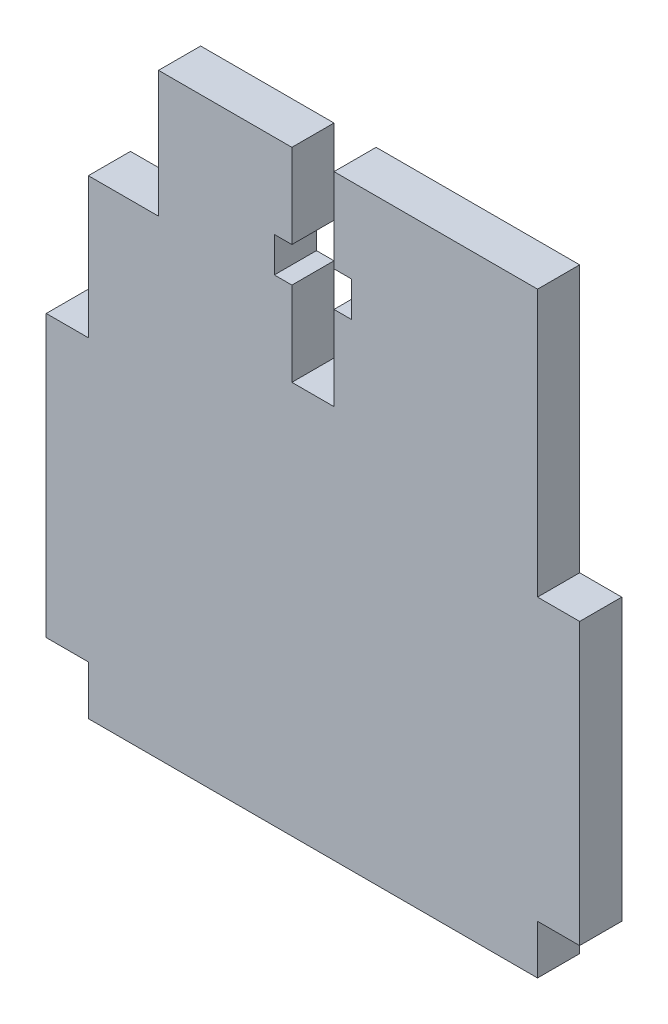
ISO-10303-21;
HEADER;
FILE_DESCRIPTION(('STEP AP214'),'2;1');
FILE_NAME('part.step','',(''),(''),'','','');
FILE_SCHEMA(('AUTOMOTIVE_DESIGN { 1 0 10303 214 1 1 1 1 }'));
ENDSEC;
DATA;
#1=APPLICATION_CONTEXT('core data for automotive mechanical design processes');
#2=APPLICATION_PROTOCOL_DEFINITION('international standard','automotive_design',2000,#1);
#3=PRODUCT_CONTEXT('',#1,'mechanical');
#4=PRODUCT('Part','Part','',(#3));
#5=PRODUCT_RELATED_PRODUCT_CATEGORY('part','',(#4));
#6=PRODUCT_DEFINITION_FORMATION('','',#4);
#7=PRODUCT_DEFINITION_CONTEXT('part definition',#1,'design');
#8=PRODUCT_DEFINITION('design','',#6,#7);
#9=PRODUCT_DEFINITION_SHAPE('','',#8);
#10=(LENGTH_UNIT() NAMED_UNIT(*) SI_UNIT(.MILLI.,.METRE.));
#11=(NAMED_UNIT(*) PLANE_ANGLE_UNIT() SI_UNIT($,.RADIAN.));
#12=(NAMED_UNIT(*) SI_UNIT($,.STERADIAN.) SOLID_ANGLE_UNIT());
#13=UNCERTAINTY_MEASURE_WITH_UNIT(LENGTH_MEASURE(1.E-05),#10,'distance_accuracy_value','');
#14=(GEOMETRIC_REPRESENTATION_CONTEXT(3) GLOBAL_UNCERTAINTY_ASSIGNED_CONTEXT((#13)) GLOBAL_UNIT_ASSIGNED_CONTEXT((#10,
#11,#12)) REPRESENTATION_CONTEXT('',''));
#15=CARTESIAN_POINT('',(0.,0.,0.));
#16=DIRECTION('',(0.,0.,1.));
#17=DIRECTION('',(1.,0.,0.));
#18=AXIS2_PLACEMENT_3D('',#15,#16,#17);
#19=CARTESIAN_POINT('',(0.,42.5,3.));
#20=DIRECTION('',(0.,-1.,0.));
#21=DIRECTION('',(0.,0.,-1.));
#22=AXIS2_PLACEMENT_3D('',#19,#20,#21);
#23=PLANE('',#22);
#24=DIRECTION('',(-1.,0.,0.));
#25=VECTOR('',#24,1.);
#26=CARTESIAN_POINT('',(0.,42.5,0.));
#27=LINE('',#26,#25);
#28=CARTESIAN_POINT('',(32.,42.5,0.));
#29=VERTEX_POINT('',#28);
#30=CARTESIAN_POINT('',(17.5,42.5,0.));
#31=VERTEX_POINT('',#30);
#32=EDGE_CURVE('E244',#29,#31,#27,.T.);
#33=ORIENTED_EDGE('',*,*,#32,.T.);
#34=DIRECTION('',(0.,0.,1.));
#35=VECTOR('',#34,1.);
#36=CARTESIAN_POINT('',(17.5,42.5,0.));
#37=LINE('',#36,#35);
#38=CARTESIAN_POINT('',(17.5,42.5,3.));
#39=VERTEX_POINT('',#38);
#40=EDGE_CURVE('E312',#31,#39,#37,.T.);
#41=ORIENTED_EDGE('',*,*,#40,.T.);
#42=DIRECTION('',(-1.,0.,0.));
#43=VECTOR('',#42,1.);
#44=CARTESIAN_POINT('',(0.,42.5,3.));
#45=LINE('',#44,#43);
#46=CARTESIAN_POINT('',(32.,42.5,3.));
#47=VERTEX_POINT('',#46);
#48=EDGE_CURVE('E237',#47,#39,#45,.T.);
#49=ORIENTED_EDGE('',*,*,#48,.F.);
#50=DIRECTION('',(0.,0.,-1.));
#51=VECTOR('',#50,1.);
#52=CARTESIAN_POINT('',(32.,42.5,3.));
#53=LINE('',#52,#51);
#54=EDGE_CURVE('E248',#47,#29,#53,.T.);
#55=ORIENTED_EDGE('',*,*,#54,.T.);
#56=EDGE_LOOP('',(#33,#41,#49,#55));
#57=FACE_BOUND('',#56,.T.);
#58=ADVANCED_FACE('F35',(#57),#23,.F.);
#59=CARTESIAN_POINT('',(0.,0.,3.));
#60=DIRECTION('',(1.,0.,0.));
#61=DIRECTION('',(0.,0.,-1.));
#62=AXIS2_PLACEMENT_3D('',#59,#60,#61);
#63=PLANE('',#62);
#64=DIRECTION('',(0.,-1.,0.));
#65=VECTOR('',#64,1.);
#66=CARTESIAN_POINT('',(0.,0.,3.));
#67=LINE('',#66,#65);
#68=CARTESIAN_POINT('',(0.,33.5,3.));
#69=VERTEX_POINT('',#68);
#70=CARTESIAN_POINT('',(0.,23.5,3.));
#71=VERTEX_POINT('',#70);
#72=EDGE_CURVE('E224',#69,#71,#67,.T.);
#73=ORIENTED_EDGE('',*,*,#72,.F.);
#74=DIRECTION('',(0.,0.,1.));
#75=VECTOR('',#74,1.);
#76=CARTESIAN_POINT('',(0.,33.5,0.));
#77=LINE('',#76,#75);
#78=CARTESIAN_POINT('',(0.,33.5,0.));
#79=VERTEX_POINT('',#78);
#80=EDGE_CURVE('E211',#79,#69,#77,.T.);
#81=ORIENTED_EDGE('',*,*,#80,.F.);
#82=DIRECTION('',(0.,-1.,0.));
#83=VECTOR('',#82,1.);
#84=CARTESIAN_POINT('',(0.,0.,0.));
#85=LINE('',#84,#83);
#86=CARTESIAN_POINT('',(0.,23.5,0.));
#87=VERTEX_POINT('',#86);
#88=EDGE_CURVE('E222',#79,#87,#85,.T.);
#89=ORIENTED_EDGE('',*,*,#88,.T.);
#90=DIRECTION('',(0.,0.,1.));
#91=VECTOR('',#90,1.);
#92=CARTESIAN_POINT('',(0.,23.5,3.));
#93=LINE('',#92,#91);
#94=EDGE_CURVE('E235',#87,#71,#93,.T.);
#95=ORIENTED_EDGE('',*,*,#94,.T.);
#96=EDGE_LOOP('',(#73,#81,#89,#95));
#97=FACE_BOUND('',#96,.T.);
#98=ADVANCED_FACE('F220',(#97),#63,.F.);
#99=CARTESIAN_POINT('',(32.,0.,3.));
#100=DIRECTION('',(-1.,0.,0.));
#101=DIRECTION('',(0.,0.,1.));
#102=AXIS2_PLACEMENT_3D('',#99,#100,#101);
#103=PLANE('',#102);
#104=DIRECTION('',(0.,1.,0.));
#105=VECTOR('',#104,1.);
#106=CARTESIAN_POINT('',(32.,0.,3.));
#107=LINE('',#106,#105);
#108=CARTESIAN_POINT('',(32.,23.5,3.));
#109=VERTEX_POINT('',#108);
#110=EDGE_CURVE('E293',#109,#47,#107,.T.);
#111=ORIENTED_EDGE('',*,*,#110,.F.);
#112=DIRECTION('',(0.,0.,-1.));
#113=VECTOR('',#112,1.);
#114=CARTESIAN_POINT('',(32.,23.5,3.));
#115=LINE('',#114,#113);
#116=CARTESIAN_POINT('',(32.,23.5,0.));
#117=VERTEX_POINT('',#116);
#118=EDGE_CURVE('E287',#109,#117,#115,.T.);
#119=ORIENTED_EDGE('',*,*,#118,.T.);
#120=DIRECTION('',(0.,1.,0.));
#121=VECTOR('',#120,1.);
#122=CARTESIAN_POINT('',(32.,0.,0.));
#123=LINE('',#122,#121);
#124=EDGE_CURVE('E233',#117,#29,#123,.T.);
#125=ORIENTED_EDGE('',*,*,#124,.T.);
#126=ORIENTED_EDGE('',*,*,#54,.F.);
#127=EDGE_LOOP('',(#111,#119,#125,#126));
#128=FACE_BOUND('',#127,.T.);
#129=ADVANCED_FACE('F307',(#128),#103,.F.);
#130=CARTESIAN_POINT('',(0.,3.5,3.));
#131=VERTEX_POINT('',#130);
#132=CARTESIAN_POINT('',(0.,0.,3.));
#133=VERTEX_POINT('',#132);
#134=EDGE_CURVE('E247',#131,#133,#67,.T.);
#135=ORIENTED_EDGE('',*,*,#134,.F.);
#136=DIRECTION('',(0.,0.,-1.));
#137=VECTOR('',#136,1.);
#138=CARTESIAN_POINT('',(0.,3.5,3.));
#139=LINE('',#138,#137);
#140=CARTESIAN_POINT('',(0.,3.5,0.));
#141=VERTEX_POINT('',#140);
#142=EDGE_CURVE('E283',#131,#141,#139,.T.);
#143=ORIENTED_EDGE('',*,*,#142,.T.);
#144=CARTESIAN_POINT('',(0.,0.,0.));
#145=VERTEX_POINT('',#144);
#146=EDGE_CURVE('E231',#141,#145,#85,.T.);
#147=ORIENTED_EDGE('',*,*,#146,.T.);
#148=DIRECTION('',(0.,0.,-1.));
#149=VECTOR('',#148,1.);
#150=CARTESIAN_POINT('',(0.,0.,3.));
#151=LINE('',#150,#149);
#152=EDGE_CURVE('E11',#133,#145,#151,.T.);
#153=ORIENTED_EDGE('',*,*,#152,.F.);
#154=EDGE_LOOP('',(#135,#143,#147,#153));
#155=FACE_BOUND('',#154,.T.);
#156=ADVANCED_FACE('F37',(#155),#63,.F.);
#157=CARTESIAN_POINT('',(0.,0.,3.));
#158=DIRECTION('',(0.,1.,0.));
#159=DIRECTION('',(0.,0.,1.));
#160=AXIS2_PLACEMENT_3D('',#157,#158,#159);
#161=PLANE('',#160);
#162=DIRECTION('',(1.,0.,0.));
#163=VECTOR('',#162,1.);
#164=CARTESIAN_POINT('',(0.,0.,0.));
#165=LINE('',#164,#163);
#166=CARTESIAN_POINT('',(32.,0.,0.));
#167=VERTEX_POINT('',#166);
#168=EDGE_CURVE('E230',#145,#167,#165,.T.);
#169=ORIENTED_EDGE('',*,*,#168,.T.);
#170=DIRECTION('',(0.,0.,-1.));
#171=VECTOR('',#170,1.);
#172=CARTESIAN_POINT('',(32.,0.,3.));
#173=LINE('',#172,#171);
#174=CARTESIAN_POINT('',(32.,0.,3.));
#175=VERTEX_POINT('',#174);
#176=EDGE_CURVE('E43',#175,#167,#173,.T.);
#177=ORIENTED_EDGE('',*,*,#176,.F.);
#178=DIRECTION('',(1.,0.,0.));
#179=VECTOR('',#178,1.);
#180=CARTESIAN_POINT('',(0.,0.,3.));
#181=LINE('',#180,#179);
#182=EDGE_CURVE('E292',#133,#175,#181,.T.);
#183=ORIENTED_EDGE('',*,*,#182,.F.);
#184=ORIENTED_EDGE('',*,*,#152,.T.);
#185=EDGE_LOOP('',(#169,#177,#183,#184));
#186=FACE_BOUND('',#185,.T.);
#187=ADVANCED_FACE('F396',(#186),#161,.F.);
#188=CARTESIAN_POINT('',(32.,3.5,0.));
#189=VERTEX_POINT('',#188);
#190=EDGE_CURVE('E240',#167,#189,#123,.T.);
#191=ORIENTED_EDGE('',*,*,#190,.T.);
#192=DIRECTION('',(0.,0.,1.));
#193=VECTOR('',#192,1.);
#194=CARTESIAN_POINT('',(32.,3.5,3.));
#195=LINE('',#194,#193);
#196=CARTESIAN_POINT('',(32.,3.5,3.));
#197=VERTEX_POINT('',#196);
#198=EDGE_CURVE('E281',#189,#197,#195,.T.);
#199=ORIENTED_EDGE('',*,*,#198,.T.);
#200=EDGE_CURVE('E258',#175,#197,#107,.T.);
#201=ORIENTED_EDGE('',*,*,#200,.F.);
#202=ORIENTED_EDGE('',*,*,#176,.T.);
#203=EDGE_LOOP('',(#191,#199,#201,#202));
#204=FACE_BOUND('',#203,.T.);
#205=ADVANCED_FACE('F255',(#204),#103,.F.);
#206=CARTESIAN_POINT('',(14.5,42.5,0.));
#207=VERTEX_POINT('',#206);
#208=CARTESIAN_POINT('',(5.,42.5,0.));
#209=VERTEX_POINT('',#208);
#210=EDGE_CURVE('E243',#207,#209,#27,.T.);
#211=ORIENTED_EDGE('',*,*,#210,.T.);
#212=DIRECTION('',(0.,0.,1.));
#213=VECTOR('',#212,1.);
#214=CARTESIAN_POINT('',(5.,42.5,0.));
#215=LINE('',#214,#213);
#216=CARTESIAN_POINT('',(5.,42.5,3.));
#217=VERTEX_POINT('',#216);
#218=EDGE_CURVE('E402',#209,#217,#215,.T.);
#219=ORIENTED_EDGE('',*,*,#218,.T.);
#220=CARTESIAN_POINT('',(14.5,42.5,3.));
#221=VERTEX_POINT('',#220);
#222=EDGE_CURVE('E294',#221,#217,#45,.T.);
#223=ORIENTED_EDGE('',*,*,#222,.F.);
#224=DIRECTION('',(0.,0.,1.));
#225=VECTOR('',#224,1.);
#226=CARTESIAN_POINT('',(14.5,42.5,0.));
#227=LINE('',#226,#225);
#228=EDGE_CURVE('E345',#207,#221,#227,.T.);
#229=ORIENTED_EDGE('',*,*,#228,.F.);
#230=EDGE_LOOP('',(#211,#219,#223,#229));
#231=FACE_BOUND('',#230,.T.);
#232=ADVANCED_FACE('F383',(#231),#23,.F.);
#233=CARTESIAN_POINT('',(0.,0.,3.));
#234=DIRECTION('',(0.,0.,-1.));
#235=DIRECTION('',(-1.,0.,0.));
#236=AXIS2_PLACEMENT_3D('',#233,#234,#235);
#237=PLANE('',#236);
#238=ORIENTED_EDGE('',*,*,#222,.T.);
#239=DIRECTION('',(0.,1.,0.));
#240=VECTOR('',#239,1.);
#241=CARTESIAN_POINT('',(5.,42.5,3.));
#242=LINE('',#241,#240);
#243=CARTESIAN_POINT('',(5.,33.5,3.));
#244=VERTEX_POINT('',#243);
#245=EDGE_CURVE('E216',#244,#217,#242,.T.);
#246=ORIENTED_EDGE('',*,*,#245,.F.);
#247=DIRECTION('',(1.,0.,0.));
#248=VECTOR('',#247,1.);
#249=CARTESIAN_POINT('',(0.,33.5,3.));
#250=LINE('',#249,#248);
#251=EDGE_CURVE('E407',#69,#244,#250,.T.);
#252=ORIENTED_EDGE('',*,*,#251,.F.);
#253=ORIENTED_EDGE('',*,*,#72,.T.);
#254=DIRECTION('',(1.,0.,0.));
#255=VECTOR('',#254,1.);
#256=CARTESIAN_POINT('',(-3.,23.5,3.));
#257=LINE('',#256,#255);
#258=CARTESIAN_POINT('',(-3.,23.5,3.));
#259=VERTEX_POINT('',#258);
#260=EDGE_CURVE('E284',#259,#71,#257,.T.);
#261=ORIENTED_EDGE('',*,*,#260,.F.);
#262=DIRECTION('',(0.,-1.,0.));
#263=VECTOR('',#262,1.);
#264=CARTESIAN_POINT('',(-3.,3.5,3.));
#265=LINE('',#264,#263);
#266=CARTESIAN_POINT('',(-3.,3.5,3.));
#267=VERTEX_POINT('',#266);
#268=EDGE_CURVE('E353',#259,#267,#265,.T.);
#269=ORIENTED_EDGE('',*,*,#268,.T.);
#270=DIRECTION('',(1.,0.,0.));
#271=VECTOR('',#270,1.);
#272=CARTESIAN_POINT('',(-3.,3.5,3.));
#273=LINE('',#272,#271);
#274=EDGE_CURVE('E272',#267,#131,#273,.T.);
#275=ORIENTED_EDGE('',*,*,#274,.T.);
#276=ORIENTED_EDGE('',*,*,#134,.T.);
#277=ORIENTED_EDGE('',*,*,#182,.T.);
#278=ORIENTED_EDGE('',*,*,#200,.T.);
#279=CARTESIAN_POINT('',(35.,3.5,3.));
#280=VERTEX_POINT('',#279);
#281=EDGE_CURVE('E276',#197,#280,#273,.T.);
#282=ORIENTED_EDGE('',*,*,#281,.T.);
#283=DIRECTION('',(0.,-1.,0.));
#284=VECTOR('',#283,1.);
#285=CARTESIAN_POINT('',(35.,3.5,3.));
#286=LINE('',#285,#284);
#287=CARTESIAN_POINT('',(35.,23.5,3.));
#288=VERTEX_POINT('',#287);
#289=EDGE_CURVE('E316',#288,#280,#286,.T.);
#290=ORIENTED_EDGE('',*,*,#289,.F.);
#291=EDGE_CURVE('E305',#109,#288,#257,.T.);
#292=ORIENTED_EDGE('',*,*,#291,.F.);
#293=ORIENTED_EDGE('',*,*,#110,.T.);
#294=ORIENTED_EDGE('',*,*,#48,.T.);
#295=DIRECTION('',(0.,1.,0.));
#296=VECTOR('',#295,1.);
#297=CARTESIAN_POINT('',(17.5,36.5,3.));
#298=LINE('',#297,#296);
#299=CARTESIAN_POINT('',(17.5,36.5,3.));
#300=VERTEX_POINT('',#299);
#301=EDGE_CURVE('E325',#300,#39,#298,.T.);
#302=ORIENTED_EDGE('',*,*,#301,.F.);
#303=DIRECTION('',(-1.,0.,0.));
#304=VECTOR('',#303,1.);
#305=CARTESIAN_POINT('',(18.75,36.5,3.));
#306=LINE('',#305,#304);
#307=CARTESIAN_POINT('',(18.75,36.5,3.));
#308=VERTEX_POINT('',#307);
#309=EDGE_CURVE('E465',#308,#300,#306,.T.);
#310=ORIENTED_EDGE('',*,*,#309,.F.);
#311=DIRECTION('',(0.,1.,0.));
#312=VECTOR('',#311,1.);
#313=CARTESIAN_POINT('',(18.75,34.,3.));
#314=LINE('',#313,#312);
#315=CARTESIAN_POINT('',(18.75,34.,3.));
#316=VERTEX_POINT('',#315);
#317=EDGE_CURVE('E463',#316,#308,#314,.T.);
#318=ORIENTED_EDGE('',*,*,#317,.F.);
#319=DIRECTION('',(1.,0.,0.));
#320=VECTOR('',#319,1.);
#321=CARTESIAN_POINT('',(17.5,34.,3.));
#322=LINE('',#321,#320);
#323=CARTESIAN_POINT('',(17.5,34.,3.));
#324=VERTEX_POINT('',#323);
#325=EDGE_CURVE('E460',#324,#316,#322,.T.);
#326=ORIENTED_EDGE('',*,*,#325,.F.);
#327=DIRECTION('',(0.,1.,0.));
#328=VECTOR('',#327,1.);
#329=CARTESIAN_POINT('',(17.5,28.,3.));
#330=LINE('',#329,#328);
#331=CARTESIAN_POINT('',(17.5,28.,3.));
#332=VERTEX_POINT('',#331);
#333=EDGE_CURVE('E457',#332,#324,#330,.T.);
#334=ORIENTED_EDGE('',*,*,#333,.F.);
#335=DIRECTION('',(1.,0.,0.));
#336=VECTOR('',#335,1.);
#337=CARTESIAN_POINT('',(14.5,28.,3.));
#338=LINE('',#337,#336);
#339=CARTESIAN_POINT('',(14.5,28.,3.));
#340=VERTEX_POINT('',#339);
#341=EDGE_CURVE('E454',#340,#332,#338,.T.);
#342=ORIENTED_EDGE('',*,*,#341,.F.);
#343=DIRECTION('',(0.,-1.,0.));
#344=VECTOR('',#343,1.);
#345=CARTESIAN_POINT('',(14.5,34.,3.));
#346=LINE('',#345,#344);
#347=CARTESIAN_POINT('',(14.5,34.,3.));
#348=VERTEX_POINT('',#347);
#349=EDGE_CURVE('E451',#348,#340,#346,.T.);
#350=ORIENTED_EDGE('',*,*,#349,.F.);
#351=DIRECTION('',(1.,0.,0.));
#352=VECTOR('',#351,1.);
#353=CARTESIAN_POINT('',(13.25,34.,3.));
#354=LINE('',#353,#352);
#355=CARTESIAN_POINT('',(13.25,34.,3.));
#356=VERTEX_POINT('',#355);
#357=EDGE_CURVE('E448',#356,#348,#354,.T.);
#358=ORIENTED_EDGE('',*,*,#357,.F.);
#359=DIRECTION('',(0.,-1.,0.));
#360=VECTOR('',#359,1.);
#361=CARTESIAN_POINT('',(13.25,36.5,3.));
#362=LINE('',#361,#360);
#363=CARTESIAN_POINT('',(13.25,36.5,3.));
#364=VERTEX_POINT('',#363);
#365=EDGE_CURVE('E445',#364,#356,#362,.T.);
#366=ORIENTED_EDGE('',*,*,#365,.F.);
#367=DIRECTION('',(-1.,0.,0.));
#368=VECTOR('',#367,1.);
#369=CARTESIAN_POINT('',(14.5,36.5,3.));
#370=LINE('',#369,#368);
#371=CARTESIAN_POINT('',(14.5,36.5,3.));
#372=VERTEX_POINT('',#371);
#373=EDGE_CURVE('E442',#372,#364,#370,.T.);
#374=ORIENTED_EDGE('',*,*,#373,.F.);
#375=DIRECTION('',(0.,-1.,0.));
#376=VECTOR('',#375,1.);
#377=CARTESIAN_POINT('',(14.5,42.5,3.));
#378=LINE('',#377,#376);
#379=EDGE_CURVE('E411',#221,#372,#378,.T.);
#380=ORIENTED_EDGE('',*,*,#379,.F.);
#381=EDGE_LOOP('',(#238,#246,#252,#253,#261,#269,#275,#276,#277,#278,#282,#290,#292,#293,#294,
#302,#310,#318,#326,#334,#342,#350,#358,#366,#374,#380));
#382=FACE_BOUND('',#381,.T.);
#383=ADVANCED_FACE('F301',(#382),#237,.F.);
#384=CARTESIAN_POINT('',(0.,0.,0.));
#385=DIRECTION('',(0.,0.,-1.));
#386=DIRECTION('',(-1.,0.,0.));
#387=AXIS2_PLACEMENT_3D('',#384,#385,#386);
#388=PLANE('',#387);
#389=DIRECTION('',(0.,1.,0.));
#390=VECTOR('',#389,1.);
#391=CARTESIAN_POINT('',(5.,42.5,0.));
#392=LINE('',#391,#390);
#393=CARTESIAN_POINT('',(5.,33.5,0.));
#394=VERTEX_POINT('',#393);
#395=EDGE_CURVE('E50',#394,#209,#392,.T.);
#396=ORIENTED_EDGE('',*,*,#395,.T.);
#397=ORIENTED_EDGE('',*,*,#210,.F.);
#398=DIRECTION('',(0.,-1.,0.));
#399=VECTOR('',#398,1.);
#400=CARTESIAN_POINT('',(14.5,42.5,0.));
#401=LINE('',#400,#399);
#402=CARTESIAN_POINT('',(14.5,36.5,0.));
#403=VERTEX_POINT('',#402);
#404=EDGE_CURVE('E404',#207,#403,#401,.T.);
#405=ORIENTED_EDGE('',*,*,#404,.T.);
#406=DIRECTION('',(-1.,0.,0.));
#407=VECTOR('',#406,1.);
#408=CARTESIAN_POINT('',(14.5,36.5,0.));
#409=LINE('',#408,#407);
#410=CARTESIAN_POINT('',(13.25,36.5,0.));
#411=VERTEX_POINT('',#410);
#412=EDGE_CURVE('E58',#403,#411,#409,.T.);
#413=ORIENTED_EDGE('',*,*,#412,.T.);
#414=DIRECTION('',(0.,-1.,0.));
#415=VECTOR('',#414,1.);
#416=CARTESIAN_POINT('',(13.25,36.5,0.));
#417=LINE('',#416,#415);
#418=CARTESIAN_POINT('',(13.25,34.,0.));
#419=VERTEX_POINT('',#418);
#420=EDGE_CURVE('E415',#411,#419,#417,.T.);
#421=ORIENTED_EDGE('',*,*,#420,.T.);
#422=DIRECTION('',(1.,0.,0.));
#423=VECTOR('',#422,1.);
#424=CARTESIAN_POINT('',(13.25,34.,0.));
#425=LINE('',#424,#423);
#426=CARTESIAN_POINT('',(14.5,34.,0.));
#427=VERTEX_POINT('',#426);
#428=EDGE_CURVE('E418',#419,#427,#425,.T.);
#429=ORIENTED_EDGE('',*,*,#428,.T.);
#430=DIRECTION('',(0.,-1.,0.));
#431=VECTOR('',#430,1.);
#432=CARTESIAN_POINT('',(14.5,34.,0.));
#433=LINE('',#432,#431);
#434=CARTESIAN_POINT('',(14.5,28.,0.));
#435=VERTEX_POINT('',#434);
#436=EDGE_CURVE('E421',#427,#435,#433,.T.);
#437=ORIENTED_EDGE('',*,*,#436,.T.);
#438=DIRECTION('',(1.,0.,0.));
#439=VECTOR('',#438,1.);
#440=CARTESIAN_POINT('',(14.5,28.,0.));
#441=LINE('',#440,#439);
#442=CARTESIAN_POINT('',(17.5,28.,0.));
#443=VERTEX_POINT('',#442);
#444=EDGE_CURVE('E424',#435,#443,#441,.T.);
#445=ORIENTED_EDGE('',*,*,#444,.T.);
#446=DIRECTION('',(0.,1.,0.));
#447=VECTOR('',#446,1.);
#448=CARTESIAN_POINT('',(17.5,28.,0.));
#449=LINE('',#448,#447);
#450=CARTESIAN_POINT('',(17.5,34.,0.));
#451=VERTEX_POINT('',#450);
#452=EDGE_CURVE('E427',#443,#451,#449,.T.);
#453=ORIENTED_EDGE('',*,*,#452,.T.);
#454=DIRECTION('',(1.,0.,0.));
#455=VECTOR('',#454,1.);
#456=CARTESIAN_POINT('',(17.5,34.,0.));
#457=LINE('',#456,#455);
#458=CARTESIAN_POINT('',(18.75,34.,0.));
#459=VERTEX_POINT('',#458);
#460=EDGE_CURVE('E430',#451,#459,#457,.T.);
#461=ORIENTED_EDGE('',*,*,#460,.T.);
#462=DIRECTION('',(0.,1.,0.));
#463=VECTOR('',#462,1.);
#464=CARTESIAN_POINT('',(18.75,34.,0.));
#465=LINE('',#464,#463);
#466=CARTESIAN_POINT('',(18.75,36.5,0.));
#467=VERTEX_POINT('',#466);
#468=EDGE_CURVE('E433',#459,#467,#465,.T.);
#469=ORIENTED_EDGE('',*,*,#468,.T.);
#470=DIRECTION('',(-1.,0.,0.));
#471=VECTOR('',#470,1.);
#472=CARTESIAN_POINT('',(18.75,36.5,0.));
#473=LINE('',#472,#471);
#474=CARTESIAN_POINT('',(17.5,36.5,0.));
#475=VERTEX_POINT('',#474);
#476=EDGE_CURVE('E436',#467,#475,#473,.T.);
#477=ORIENTED_EDGE('',*,*,#476,.T.);
#478=DIRECTION('',(0.,1.,0.));
#479=VECTOR('',#478,1.);
#480=CARTESIAN_POINT('',(17.5,36.5,0.));
#481=LINE('',#480,#479);
#482=EDGE_CURVE('E346',#475,#31,#481,.T.);
#483=ORIENTED_EDGE('',*,*,#482,.T.);
#484=ORIENTED_EDGE('',*,*,#32,.F.);
#485=ORIENTED_EDGE('',*,*,#124,.F.);
#486=DIRECTION('',(1.,0.,0.));
#487=VECTOR('',#486,1.);
#488=CARTESIAN_POINT('',(-3.,23.5,0.));
#489=LINE('',#488,#487);
#490=CARTESIAN_POINT('',(35.,23.5,0.));
#491=VERTEX_POINT('',#490);
#492=EDGE_CURVE('E274',#117,#491,#489,.T.);
#493=ORIENTED_EDGE('',*,*,#492,.T.);
#494=DIRECTION('',(0.,1.,0.));
#495=VECTOR('',#494,1.);
#496=CARTESIAN_POINT('',(35.,3.5,0.));
#497=LINE('',#496,#495);
#498=CARTESIAN_POINT('',(35.,3.5,0.));
#499=VERTEX_POINT('',#498);
#500=EDGE_CURVE('E267',#499,#491,#497,.T.);
#501=ORIENTED_EDGE('',*,*,#500,.F.);
#502=DIRECTION('',(1.,0.,0.));
#503=VECTOR('',#502,1.);
#504=CARTESIAN_POINT('',(-3.,3.5,0.));
#505=LINE('',#504,#503);
#506=EDGE_CURVE('E265',#189,#499,#505,.T.);
#507=ORIENTED_EDGE('',*,*,#506,.F.);
#508=ORIENTED_EDGE('',*,*,#190,.F.);
#509=ORIENTED_EDGE('',*,*,#168,.F.);
#510=ORIENTED_EDGE('',*,*,#146,.F.);
#511=CARTESIAN_POINT('',(-3.,3.5,0.));
#512=VERTEX_POINT('',#511);
#513=EDGE_CURVE('E271',#512,#141,#505,.T.);
#514=ORIENTED_EDGE('',*,*,#513,.F.);
#515=DIRECTION('',(0.,1.,0.));
#516=VECTOR('',#515,1.);
#517=CARTESIAN_POINT('',(-3.,3.5,0.));
#518=LINE('',#517,#516);
#519=CARTESIAN_POINT('',(-3.,23.5,0.));
#520=VERTEX_POINT('',#519);
#521=EDGE_CURVE('E359',#512,#520,#518,.T.);
#522=ORIENTED_EDGE('',*,*,#521,.T.);
#523=EDGE_CURVE('E229',#520,#87,#489,.T.);
#524=ORIENTED_EDGE('',*,*,#523,.T.);
#525=ORIENTED_EDGE('',*,*,#88,.F.);
#526=DIRECTION('',(1.,0.,0.));
#527=VECTOR('',#526,1.);
#528=CARTESIAN_POINT('',(0.,33.5,0.));
#529=LINE('',#528,#527);
#530=EDGE_CURVE('E207',#79,#394,#529,.T.);
#531=ORIENTED_EDGE('',*,*,#530,.T.);
#532=EDGE_LOOP('',(#396,#397,#405,#413,#421,#429,#437,#445,#453,#461,#469,#477,#483,#484,#485,
#493,#501,#507,#508,#509,#510,#514,#522,#524,#525,#531));
#533=FACE_BOUND('',#532,.T.);
#534=ADVANCED_FACE('F227',(#533),#388,.T.);
#535=CARTESIAN_POINT('',(35.,0.,0.));
#536=DIRECTION('',(-1.,0.,0.));
#537=DIRECTION('',(0.,0.,1.));
#538=AXIS2_PLACEMENT_3D('',#535,#536,#537);
#539=PLANE('',#538);
#540=ORIENTED_EDGE('',*,*,#289,.T.);
#541=DIRECTION('',(0.,0.,-1.));
#542=VECTOR('',#541,1.);
#543=CARTESIAN_POINT('',(35.,3.5,3.));
#544=LINE('',#543,#542);
#545=EDGE_CURVE('E320',#280,#499,#544,.T.);
#546=ORIENTED_EDGE('',*,*,#545,.T.);
#547=ORIENTED_EDGE('',*,*,#500,.T.);
#548=DIRECTION('',(0.,0.,1.));
#549=VECTOR('',#548,1.);
#550=CARTESIAN_POINT('',(35.,23.5,3.));
#551=LINE('',#550,#549);
#552=EDGE_CURVE('E350',#491,#288,#551,.T.);
#553=ORIENTED_EDGE('',*,*,#552,.T.);
#554=EDGE_LOOP('',(#540,#546,#547,#553));
#555=FACE_BOUND('',#554,.T.);
#556=ADVANCED_FACE('F368',(#555),#539,.F.);
#557=CARTESIAN_POINT('',(-3.,3.5,3.));
#558=DIRECTION('',(0.,-1.,0.));
#559=DIRECTION('',(0.,0.,-1.));
#560=AXIS2_PLACEMENT_3D('',#557,#558,#559);
#561=PLANE('',#560);
#562=ORIENTED_EDGE('',*,*,#198,.F.);
#563=ORIENTED_EDGE('',*,*,#506,.T.);
#564=ORIENTED_EDGE('',*,*,#545,.F.);
#565=ORIENTED_EDGE('',*,*,#281,.F.);
#566=EDGE_LOOP('',(#562,#563,#564,#565));
#567=FACE_BOUND('',#566,.T.);
#568=ADVANCED_FACE('F372',(#567),#561,.T.);
#569=CARTESIAN_POINT('',(-3.,23.5,3.));
#570=DIRECTION('',(0.,1.,0.));
#571=DIRECTION('',(0.,0.,1.));
#572=AXIS2_PLACEMENT_3D('',#569,#570,#571);
#573=PLANE('',#572);
#574=ORIENTED_EDGE('',*,*,#118,.F.);
#575=ORIENTED_EDGE('',*,*,#291,.T.);
#576=ORIENTED_EDGE('',*,*,#552,.F.);
#577=ORIENTED_EDGE('',*,*,#492,.F.);
#578=EDGE_LOOP('',(#574,#575,#576,#577));
#579=FACE_BOUND('',#578,.T.);
#580=ADVANCED_FACE('F369',(#579),#573,.T.);
#581=ORIENTED_EDGE('',*,*,#94,.F.);
#582=ORIENTED_EDGE('',*,*,#523,.F.);
#583=DIRECTION('',(0.,0.,1.));
#584=VECTOR('',#583,1.);
#585=CARTESIAN_POINT('',(-3.,23.5,3.));
#586=LINE('',#585,#584);
#587=EDGE_CURVE('E361',#520,#259,#586,.T.);
#588=ORIENTED_EDGE('',*,*,#587,.T.);
#589=ORIENTED_EDGE('',*,*,#260,.T.);
#590=EDGE_LOOP('',(#581,#582,#588,#589));
#591=FACE_BOUND('',#590,.T.);
#592=ADVANCED_FACE('F371',(#591),#573,.T.);
#593=ORIENTED_EDGE('',*,*,#142,.F.);
#594=ORIENTED_EDGE('',*,*,#274,.F.);
#595=DIRECTION('',(0.,0.,-1.));
#596=VECTOR('',#595,1.);
#597=CARTESIAN_POINT('',(-3.,3.5,3.));
#598=LINE('',#597,#596);
#599=EDGE_CURVE('E356',#267,#512,#598,.T.);
#600=ORIENTED_EDGE('',*,*,#599,.T.);
#601=ORIENTED_EDGE('',*,*,#513,.T.);
#602=EDGE_LOOP('',(#593,#594,#600,#601));
#603=FACE_BOUND('',#602,.T.);
#604=ADVANCED_FACE('F378',(#603),#561,.T.);
#605=CARTESIAN_POINT('',(-3.,0.,0.));
#606=DIRECTION('',(-1.,0.,0.));
#607=DIRECTION('',(0.,0.,1.));
#608=AXIS2_PLACEMENT_3D('',#605,#606,#607);
#609=PLANE('',#608);
#610=ORIENTED_EDGE('',*,*,#268,.F.);
#611=ORIENTED_EDGE('',*,*,#587,.F.);
#612=ORIENTED_EDGE('',*,*,#521,.F.);
#613=ORIENTED_EDGE('',*,*,#599,.F.);
#614=EDGE_LOOP('',(#610,#611,#612,#613));
#615=FACE_BOUND('',#614,.T.);
#616=ADVANCED_FACE('F518',(#615),#609,.T.);
#617=CARTESIAN_POINT('',(17.5,36.5,0.));
#618=DIRECTION('',(1.,0.,0.));
#619=DIRECTION('',(0.,1.,0.));
#620=AXIS2_PLACEMENT_3D('',#617,#618,#619);
#621=PLANE('',#620);
#622=ORIENTED_EDGE('',*,*,#301,.T.);
#623=ORIENTED_EDGE('',*,*,#40,.F.);
#624=ORIENTED_EDGE('',*,*,#482,.F.);
#625=DIRECTION('',(0.,0.,1.));
#626=VECTOR('',#625,1.);
#627=CARTESIAN_POINT('',(17.5,36.5,0.));
#628=LINE('',#627,#626);
#629=EDGE_CURVE('E317',#475,#300,#628,.T.);
#630=ORIENTED_EDGE('',*,*,#629,.T.);
#631=EDGE_LOOP('',(#622,#623,#624,#630));
#632=FACE_BOUND('',#631,.T.);
#633=ADVANCED_FACE('F469',(#632),#621,.F.);
#634=CARTESIAN_POINT('',(18.75,36.5,0.));
#635=DIRECTION('',(0.,1.,0.));
#636=DIRECTION('',(0.,0.,1.));
#637=AXIS2_PLACEMENT_3D('',#634,#635,#636);
#638=PLANE('',#637);
#639=ORIENTED_EDGE('',*,*,#309,.T.);
#640=ORIENTED_EDGE('',*,*,#629,.F.);
#641=ORIENTED_EDGE('',*,*,#476,.F.);
#642=DIRECTION('',(0.,0.,1.));
#643=VECTOR('',#642,1.);
#644=CARTESIAN_POINT('',(18.75,36.5,0.));
#645=LINE('',#644,#643);
#646=EDGE_CURVE('E322',#467,#308,#645,.T.);
#647=ORIENTED_EDGE('',*,*,#646,.T.);
#648=EDGE_LOOP('',(#639,#640,#641,#647));
#649=FACE_BOUND('',#648,.T.);
#650=ADVANCED_FACE('F517',(#649),#638,.F.);
#651=CARTESIAN_POINT('',(18.75,34.,0.));
#652=DIRECTION('',(1.,0.,0.));
#653=DIRECTION('',(0.,1.,0.));
#654=AXIS2_PLACEMENT_3D('',#651,#652,#653);
#655=PLANE('',#654);
#656=ORIENTED_EDGE('',*,*,#317,.T.);
#657=ORIENTED_EDGE('',*,*,#646,.F.);
#658=ORIENTED_EDGE('',*,*,#468,.F.);
#659=DIRECTION('',(0.,0.,1.));
#660=VECTOR('',#659,1.);
#661=CARTESIAN_POINT('',(18.75,34.,0.));
#662=LINE('',#661,#660);
#663=EDGE_CURVE('E329',#459,#316,#662,.T.);
#664=ORIENTED_EDGE('',*,*,#663,.T.);
#665=EDGE_LOOP('',(#656,#657,#658,#664));
#666=FACE_BOUND('',#665,.T.);
#667=ADVANCED_FACE('F474',(#666),#655,.F.);
#668=CARTESIAN_POINT('',(17.5,34.,0.));
#669=DIRECTION('',(0.,-1.,0.));
#670=DIRECTION('',(1.,0.,0.));
#671=AXIS2_PLACEMENT_3D('',#668,#669,#670);
#672=PLANE('',#671);
#673=ORIENTED_EDGE('',*,*,#325,.T.);
#674=ORIENTED_EDGE('',*,*,#663,.F.);
#675=ORIENTED_EDGE('',*,*,#460,.F.);
#676=DIRECTION('',(0.,0.,1.));
#677=VECTOR('',#676,1.);
#678=CARTESIAN_POINT('',(17.5,34.,0.));
#679=LINE('',#678,#677);
#680=EDGE_CURVE('E331',#451,#324,#679,.T.);
#681=ORIENTED_EDGE('',*,*,#680,.T.);
#682=EDGE_LOOP('',(#673,#674,#675,#681));
#683=FACE_BOUND('',#682,.T.);
#684=ADVANCED_FACE('F479',(#683),#672,.F.);
#685=CARTESIAN_POINT('',(17.5,28.,0.));
#686=DIRECTION('',(1.,0.,0.));
#687=DIRECTION('',(0.,1.,0.));
#688=AXIS2_PLACEMENT_3D('',#685,#686,#687);
#689=PLANE('',#688);
#690=ORIENTED_EDGE('',*,*,#333,.T.);
#691=ORIENTED_EDGE('',*,*,#680,.F.);
#692=ORIENTED_EDGE('',*,*,#452,.F.);
#693=DIRECTION('',(0.,0.,1.));
#694=VECTOR('',#693,1.);
#695=CARTESIAN_POINT('',(17.5,28.,0.));
#696=LINE('',#695,#694);
#697=EDGE_CURVE('E333',#443,#332,#696,.T.);
#698=ORIENTED_EDGE('',*,*,#697,.T.);
#699=EDGE_LOOP('',(#690,#691,#692,#698));
#700=FACE_BOUND('',#699,.T.);
#701=ADVANCED_FACE('F482',(#700),#689,.F.);
#702=CARTESIAN_POINT('',(14.5,28.,0.));
#703=DIRECTION('',(0.,-1.,0.));
#704=DIRECTION('',(0.,0.,-1.));
#705=AXIS2_PLACEMENT_3D('',#702,#703,#704);
#706=PLANE('',#705);
#707=ORIENTED_EDGE('',*,*,#341,.T.);
#708=ORIENTED_EDGE('',*,*,#697,.F.);
#709=ORIENTED_EDGE('',*,*,#444,.F.);
#710=DIRECTION('',(0.,0.,1.));
#711=VECTOR('',#710,1.);
#712=CARTESIAN_POINT('',(14.5,28.,0.));
#713=LINE('',#712,#711);
#714=EDGE_CURVE('E335',#435,#340,#713,.T.);
#715=ORIENTED_EDGE('',*,*,#714,.T.);
#716=EDGE_LOOP('',(#707,#708,#709,#715));
#717=FACE_BOUND('',#716,.T.);
#718=ADVANCED_FACE('F487',(#717),#706,.F.);
#719=CARTESIAN_POINT('',(14.5,34.,0.));
#720=DIRECTION('',(-1.,0.,0.));
#721=DIRECTION('',(0.,0.,1.));
#722=AXIS2_PLACEMENT_3D('',#719,#720,#721);
#723=PLANE('',#722);
#724=ORIENTED_EDGE('',*,*,#349,.T.);
#725=ORIENTED_EDGE('',*,*,#714,.F.);
#726=ORIENTED_EDGE('',*,*,#436,.F.);
#727=DIRECTION('',(0.,0.,1.));
#728=VECTOR('',#727,1.);
#729=CARTESIAN_POINT('',(14.5,34.,0.));
#730=LINE('',#729,#728);
#731=EDGE_CURVE('E337',#427,#348,#730,.T.);
#732=ORIENTED_EDGE('',*,*,#731,.T.);
#733=EDGE_LOOP('',(#724,#725,#726,#732));
#734=FACE_BOUND('',#733,.T.);
#735=ADVANCED_FACE('F491',(#734),#723,.F.);
#736=CARTESIAN_POINT('',(13.25,34.,0.));
#737=DIRECTION('',(0.,-1.,0.));
#738=DIRECTION('',(1.,0.,0.));
#739=AXIS2_PLACEMENT_3D('',#736,#737,#738);
#740=PLANE('',#739);
#741=ORIENTED_EDGE('',*,*,#357,.T.);
#742=ORIENTED_EDGE('',*,*,#731,.F.);
#743=ORIENTED_EDGE('',*,*,#428,.F.);
#744=DIRECTION('',(0.,0.,1.));
#745=VECTOR('',#744,1.);
#746=CARTESIAN_POINT('',(13.25,34.,0.));
#747=LINE('',#746,#745);
#748=EDGE_CURVE('E339',#419,#356,#747,.T.);
#749=ORIENTED_EDGE('',*,*,#748,.T.);
#750=EDGE_LOOP('',(#741,#742,#743,#749));
#751=FACE_BOUND('',#750,.T.);
#752=ADVANCED_FACE('F494',(#751),#740,.F.);
#753=CARTESIAN_POINT('',(13.25,36.5,0.));
#754=DIRECTION('',(-1.,0.,0.));
#755=DIRECTION('',(0.,0.,1.));
#756=AXIS2_PLACEMENT_3D('',#753,#754,#755);
#757=PLANE('',#756);
#758=ORIENTED_EDGE('',*,*,#365,.T.);
#759=ORIENTED_EDGE('',*,*,#748,.F.);
#760=ORIENTED_EDGE('',*,*,#420,.F.);
#761=DIRECTION('',(0.,0.,1.));
#762=VECTOR('',#761,1.);
#763=CARTESIAN_POINT('',(13.25,36.5,0.));
#764=LINE('',#763,#762);
#765=EDGE_CURVE('E341',#411,#364,#764,.T.);
#766=ORIENTED_EDGE('',*,*,#765,.T.);
#767=EDGE_LOOP('',(#758,#759,#760,#766));
#768=FACE_BOUND('',#767,.T.);
#769=ADVANCED_FACE('F499',(#768),#757,.F.);
#770=CARTESIAN_POINT('',(14.5,36.5,0.));
#771=DIRECTION('',(0.,1.,0.));
#772=DIRECTION('',(0.,0.,1.));
#773=AXIS2_PLACEMENT_3D('',#770,#771,#772);
#774=PLANE('',#773);
#775=ORIENTED_EDGE('',*,*,#373,.T.);
#776=ORIENTED_EDGE('',*,*,#765,.F.);
#777=ORIENTED_EDGE('',*,*,#412,.F.);
#778=DIRECTION('',(0.,0.,1.));
#779=VECTOR('',#778,1.);
#780=CARTESIAN_POINT('',(14.5,36.5,0.));
#781=LINE('',#780,#779);
#782=EDGE_CURVE('E343',#403,#372,#781,.T.);
#783=ORIENTED_EDGE('',*,*,#782,.T.);
#784=EDGE_LOOP('',(#775,#776,#777,#783));
#785=FACE_BOUND('',#784,.T.);
#786=ADVANCED_FACE('F501',(#785),#774,.F.);
#787=CARTESIAN_POINT('',(14.5,42.5,0.));
#788=DIRECTION('',(-1.,0.,0.));
#789=DIRECTION('',(0.,-1.,0.));
#790=AXIS2_PLACEMENT_3D('',#787,#788,#789);
#791=PLANE('',#790);
#792=ORIENTED_EDGE('',*,*,#379,.T.);
#793=ORIENTED_EDGE('',*,*,#782,.F.);
#794=ORIENTED_EDGE('',*,*,#404,.F.);
#795=ORIENTED_EDGE('',*,*,#228,.T.);
#796=EDGE_LOOP('',(#792,#793,#794,#795));
#797=FACE_BOUND('',#796,.T.);
#798=ADVANCED_FACE('F503',(#797),#791,.F.);
#799=CARTESIAN_POINT('',(5.,42.5,0.));
#800=DIRECTION('',(1.,0.,0.));
#801=DIRECTION('',(0.,1.,0.));
#802=AXIS2_PLACEMENT_3D('',#799,#800,#801);
#803=PLANE('',#802);
#804=ORIENTED_EDGE('',*,*,#245,.T.);
#805=ORIENTED_EDGE('',*,*,#218,.F.);
#806=ORIENTED_EDGE('',*,*,#395,.F.);
#807=DIRECTION('',(0.,0.,1.));
#808=VECTOR('',#807,1.);
#809=CARTESIAN_POINT('',(5.,33.5,0.));
#810=LINE('',#809,#808);
#811=EDGE_CURVE('E213',#394,#244,#810,.T.);
#812=ORIENTED_EDGE('',*,*,#811,.T.);
#813=EDGE_LOOP('',(#804,#805,#806,#812));
#814=FACE_BOUND('',#813,.T.);
#815=ADVANCED_FACE('F505',(#814),#803,.F.);
#816=CARTESIAN_POINT('',(0.,33.5,0.));
#817=DIRECTION('',(0.,-1.,0.));
#818=DIRECTION('',(0.,0.,-1.));
#819=AXIS2_PLACEMENT_3D('',#816,#817,#818);
#820=PLANE('',#819);
#821=ORIENTED_EDGE('',*,*,#251,.T.);
#822=ORIENTED_EDGE('',*,*,#811,.F.);
#823=ORIENTED_EDGE('',*,*,#530,.F.);
#824=ORIENTED_EDGE('',*,*,#80,.T.);
#825=EDGE_LOOP('',(#821,#822,#823,#824));
#826=FACE_BOUND('',#825,.T.);
#827=ADVANCED_FACE('F210',(#826),#820,.F.);
#828=CLOSED_SHELL('',(#58,#98,#129,#156,#187,#205,#232,#383,#534,#556,#568,#580,#592,#604,#616,
#633,#650,#667,#684,#701,#718,#735,#752,#769,#786,#798,#815,#827));
#829=MANIFOLD_SOLID_BREP('B2',#828);
#830=ADVANCED_BREP_SHAPE_REPRESENTATION('',(#18,#829),#14);
#831=SHAPE_DEFINITION_REPRESENTATION(#9,#830);
ENDSEC;
END-ISO-10303-21;
